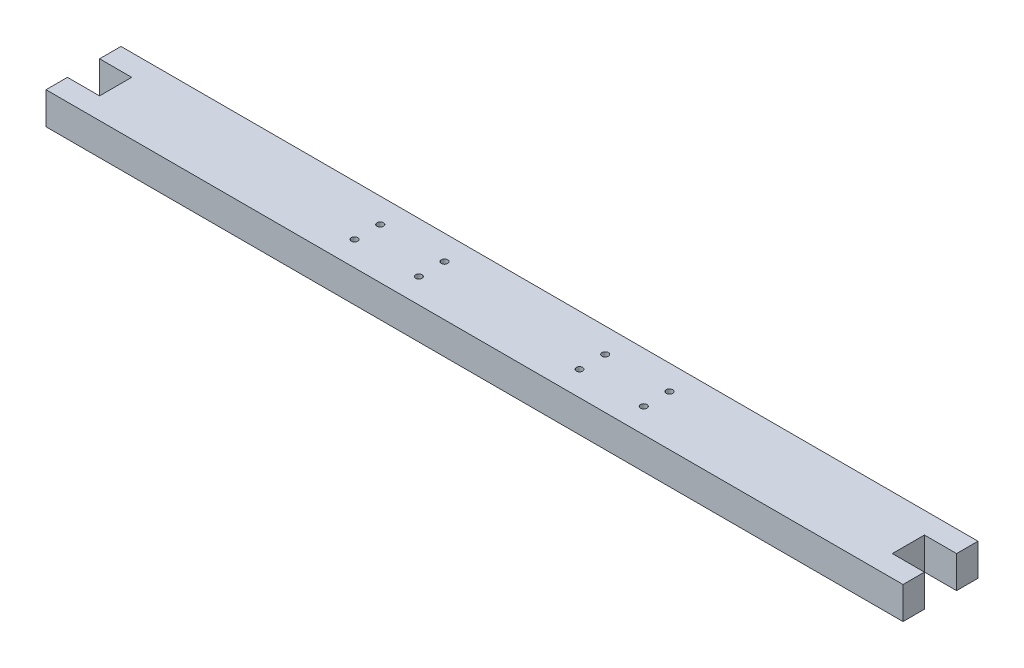
ISO-10303-21;
HEADER;
FILE_DESCRIPTION(('STEP AP214'),'2;1');
FILE_NAME('part.step','',(''),(''),'','','');
FILE_SCHEMA(('AUTOMOTIVE_DESIGN { 1 0 10303 214 1 1 1 1 }'));
ENDSEC;
DATA;
#1=APPLICATION_CONTEXT('core data for automotive mechanical design processes');
#2=APPLICATION_PROTOCOL_DEFINITION('international standard','automotive_design',2000,#1);
#3=PRODUCT_CONTEXT('',#1,'mechanical');
#4=PRODUCT('Part','Part','',(#3));
#5=PRODUCT_RELATED_PRODUCT_CATEGORY('part','',(#4));
#6=PRODUCT_DEFINITION_FORMATION('','',#4);
#7=PRODUCT_DEFINITION_CONTEXT('part definition',#1,'design');
#8=PRODUCT_DEFINITION('design','',#6,#7);
#9=PRODUCT_DEFINITION_SHAPE('','',#8);
#10=(LENGTH_UNIT() NAMED_UNIT(*) SI_UNIT(.MILLI.,.METRE.));
#11=(NAMED_UNIT(*) PLANE_ANGLE_UNIT() SI_UNIT($,.RADIAN.));
#12=(NAMED_UNIT(*) SI_UNIT($,.STERADIAN.) SOLID_ANGLE_UNIT());
#13=UNCERTAINTY_MEASURE_WITH_UNIT(LENGTH_MEASURE(1.E-05),#10,'distance_accuracy_value','');
#14=(GEOMETRIC_REPRESENTATION_CONTEXT(3) GLOBAL_UNCERTAINTY_ASSIGNED_CONTEXT((#13)) GLOBAL_UNIT_ASSIGNED_CONTEXT((#10,
#11,#12)) REPRESENTATION_CONTEXT('',''));
#15=CARTESIAN_POINT('',(0.,0.,0.));
#16=DIRECTION('',(0.,0.,1.));
#17=DIRECTION('',(1.,0.,0.));
#18=AXIS2_PLACEMENT_3D('',#15,#16,#17);
#19=CARTESIAN_POINT('',(0.,15.,-25.));
#20=DIRECTION('',(-1.,0.,0.));
#21=DIRECTION('',(0.,0.,1.));
#22=AXIS2_PLACEMENT_3D('',#19,#20,#21);
#23=PLANE('',#22);
#24=DIRECTION('',(0.,0.,-1.));
#25=VECTOR('',#24,1.);
#26=CARTESIAN_POINT('',(0.,0.,-25.));
#27=LINE('',#26,#25);
#28=CARTESIAN_POINT('',(0.,0.,-25.));
#29=VERTEX_POINT('',#28);
#30=CARTESIAN_POINT('',(0.,0.,-35.));
#31=VERTEX_POINT('',#30);
#32=EDGE_CURVE('E158',#29,#31,#27,.T.);
#33=ORIENTED_EDGE('',*,*,#32,.F.);
#34=DIRECTION('',(0.,-1.,0.));
#35=VECTOR('',#34,1.);
#36=CARTESIAN_POINT('',(0.,15.,-25.));
#37=LINE('',#36,#35);
#38=CARTESIAN_POINT('',(0.,15.,-25.));
#39=VERTEX_POINT('',#38);
#40=EDGE_CURVE('E11',#39,#29,#37,.T.);
#41=ORIENTED_EDGE('',*,*,#40,.F.);
#42=DIRECTION('',(0.,0.,-1.));
#43=VECTOR('',#42,1.);
#44=CARTESIAN_POINT('',(0.,15.,-25.));
#45=LINE('',#44,#43);
#46=CARTESIAN_POINT('',(0.,15.,-35.));
#47=VERTEX_POINT('',#46);
#48=EDGE_CURVE('E187',#39,#47,#45,.T.);
#49=ORIENTED_EDGE('',*,*,#48,.T.);
#50=DIRECTION('',(0.,-1.,0.));
#51=VECTOR('',#50,1.);
#52=CARTESIAN_POINT('',(0.,15.,-35.));
#53=LINE('',#52,#51);
#54=EDGE_CURVE('E39',#47,#31,#53,.T.);
#55=ORIENTED_EDGE('',*,*,#54,.T.);
#56=EDGE_LOOP('',(#33,#41,#49,#55));
#57=FACE_BOUND('',#56,.T.);
#58=ADVANCED_FACE('F36',(#57),#23,.T.);
#59=CARTESIAN_POINT('',(0.,15.,-25.));
#60=DIRECTION('',(0.,0.,-1.));
#61=DIRECTION('',(-1.,0.,0.));
#62=AXIS2_PLACEMENT_3D('',#59,#60,#61);
#63=PLANE('',#62);
#64=DIRECTION('',(1.,0.,0.));
#65=VECTOR('',#64,1.);
#66=CARTESIAN_POINT('',(0.,0.,-25.));
#67=LINE('',#66,#65);
#68=CARTESIAN_POINT('',(15.,0.,-25.));
#69=VERTEX_POINT('',#68);
#70=EDGE_CURVE('E186',#29,#69,#67,.T.);
#71=ORIENTED_EDGE('',*,*,#70,.T.);
#72=DIRECTION('',(0.,-1.,0.));
#73=VECTOR('',#72,1.);
#74=CARTESIAN_POINT('',(15.,15.,-25.));
#75=LINE('',#74,#73);
#76=CARTESIAN_POINT('',(15.,15.,-25.));
#77=VERTEX_POINT('',#76);
#78=EDGE_CURVE('E45',#77,#69,#75,.T.);
#79=ORIENTED_EDGE('',*,*,#78,.F.);
#80=DIRECTION('',(1.,0.,0.));
#81=VECTOR('',#80,1.);
#82=CARTESIAN_POINT('',(0.,15.,-25.));
#83=LINE('',#82,#81);
#84=EDGE_CURVE('E148',#39,#77,#83,.T.);
#85=ORIENTED_EDGE('',*,*,#84,.F.);
#86=ORIENTED_EDGE('',*,*,#40,.T.);
#87=EDGE_LOOP('',(#71,#79,#85,#86));
#88=FACE_BOUND('',#87,.T.);
#89=ADVANCED_FACE('F211',(#88),#63,.F.);
#90=CARTESIAN_POINT('',(15.,15.,-10.));
#91=DIRECTION('',(-1.,0.,0.));
#92=DIRECTION('',(0.,0.,1.));
#93=AXIS2_PLACEMENT_3D('',#90,#91,#92);
#94=PLANE('',#93);
#95=DIRECTION('',(0.,0.,-1.));
#96=VECTOR('',#95,1.);
#97=CARTESIAN_POINT('',(15.,0.,-10.));
#98=LINE('',#97,#96);
#99=CARTESIAN_POINT('',(15.,0.,-10.));
#100=VERTEX_POINT('',#99);
#101=EDGE_CURVE('E134',#100,#69,#98,.T.);
#102=ORIENTED_EDGE('',*,*,#101,.F.);
#103=DIRECTION('',(0.,-1.,0.));
#104=VECTOR('',#103,1.);
#105=CARTESIAN_POINT('',(15.,15.,-10.));
#106=LINE('',#105,#104);
#107=CARTESIAN_POINT('',(15.,15.,-10.));
#108=VERTEX_POINT('',#107);
#109=EDGE_CURVE('E129',#108,#100,#106,.T.);
#110=ORIENTED_EDGE('',*,*,#109,.F.);
#111=DIRECTION('',(0.,0.,-1.));
#112=VECTOR('',#111,1.);
#113=CARTESIAN_POINT('',(15.,15.,-10.));
#114=LINE('',#113,#112);
#115=EDGE_CURVE('E132',#108,#77,#114,.T.);
#116=ORIENTED_EDGE('',*,*,#115,.T.);
#117=ORIENTED_EDGE('',*,*,#78,.T.);
#118=EDGE_LOOP('',(#102,#110,#116,#117));
#119=FACE_BOUND('',#118,.T.);
#120=ADVANCED_FACE('F131',(#119),#94,.T.);
#121=CARTESIAN_POINT('',(0.,15.,-10.));
#122=DIRECTION('',(0.,0.,-1.));
#123=DIRECTION('',(-1.,0.,0.));
#124=AXIS2_PLACEMENT_3D('',#121,#122,#123);
#125=PLANE('',#124);
#126=DIRECTION('',(1.,0.,0.));
#127=VECTOR('',#126,1.);
#128=CARTESIAN_POINT('',(0.,0.,-10.));
#129=LINE('',#128,#127);
#130=CARTESIAN_POINT('',(0.,0.,-10.));
#131=VERTEX_POINT('',#130);
#132=EDGE_CURVE('E183',#131,#100,#129,.T.);
#133=ORIENTED_EDGE('',*,*,#132,.F.);
#134=DIRECTION('',(0.,-1.,0.));
#135=VECTOR('',#134,1.);
#136=CARTESIAN_POINT('',(0.,15.,-10.));
#137=LINE('',#136,#135);
#138=CARTESIAN_POINT('',(0.,15.,-10.));
#139=VERTEX_POINT('',#138);
#140=EDGE_CURVE('E139',#139,#131,#137,.T.);
#141=ORIENTED_EDGE('',*,*,#140,.F.);
#142=DIRECTION('',(1.,0.,0.));
#143=VECTOR('',#142,1.);
#144=CARTESIAN_POINT('',(0.,15.,-10.));
#145=LINE('',#144,#143);
#146=EDGE_CURVE('E146',#139,#108,#145,.T.);
#147=ORIENTED_EDGE('',*,*,#146,.T.);
#148=ORIENTED_EDGE('',*,*,#109,.T.);
#149=EDGE_LOOP('',(#133,#141,#147,#148));
#150=FACE_BOUND('',#149,.T.);
#151=ADVANCED_FACE('F150',(#150),#125,.T.);
#152=CARTESIAN_POINT('',(0.,15.,0.));
#153=DIRECTION('',(-1.,0.,0.));
#154=DIRECTION('',(0.,0.,1.));
#155=AXIS2_PLACEMENT_3D('',#152,#153,#154);
#156=PLANE('',#155);
#157=DIRECTION('',(0.,0.,-1.));
#158=VECTOR('',#157,1.);
#159=CARTESIAN_POINT('',(0.,0.,0.));
#160=LINE('',#159,#158);
#161=CARTESIAN_POINT('',(0.,0.,0.));
#162=VERTEX_POINT('',#161);
#163=EDGE_CURVE('E180',#162,#131,#160,.T.);
#164=ORIENTED_EDGE('',*,*,#163,.F.);
#165=DIRECTION('',(0.,-1.,0.));
#166=VECTOR('',#165,1.);
#167=CARTESIAN_POINT('',(0.,15.,0.));
#168=LINE('',#167,#166);
#169=CARTESIAN_POINT('',(0.,15.,0.));
#170=VERTEX_POINT('',#169);
#171=EDGE_CURVE('E191',#170,#162,#168,.T.);
#172=ORIENTED_EDGE('',*,*,#171,.F.);
#173=DIRECTION('',(0.,0.,-1.));
#174=VECTOR('',#173,1.);
#175=CARTESIAN_POINT('',(0.,15.,0.));
#176=LINE('',#175,#174);
#177=EDGE_CURVE('E151',#170,#139,#176,.T.);
#178=ORIENTED_EDGE('',*,*,#177,.T.);
#179=ORIENTED_EDGE('',*,*,#140,.T.);
#180=EDGE_LOOP('',(#164,#172,#178,#179));
#181=FACE_BOUND('',#180,.T.);
#182=ADVANCED_FACE('F258',(#181),#156,.T.);
#183=CARTESIAN_POINT('',(0.,15.,0.));
#184=DIRECTION('',(0.,0.,-1.));
#185=DIRECTION('',(-1.,0.,0.));
#186=AXIS2_PLACEMENT_3D('',#183,#184,#185);
#187=PLANE('',#186);
#188=DIRECTION('',(1.,0.,0.));
#189=VECTOR('',#188,1.);
#190=CARTESIAN_POINT('',(0.,0.,0.));
#191=LINE('',#190,#189);
#192=CARTESIAN_POINT('',(400.,0.,1.01307850997046E-13));
#193=VERTEX_POINT('',#192);
#194=EDGE_CURVE('E178',#162,#193,#191,.T.);
#195=ORIENTED_EDGE('',*,*,#194,.T.);
#196=DIRECTION('',(0.,-1.,0.));
#197=VECTOR('',#196,1.);
#198=CARTESIAN_POINT('',(400.,15.,1.01307850997046E-13));
#199=LINE('',#198,#197);
#200=CARTESIAN_POINT('',(400.,15.,1.01307850997046E-13));
#201=VERTEX_POINT('',#200);
#202=EDGE_CURVE('E193',#201,#193,#199,.T.);
#203=ORIENTED_EDGE('',*,*,#202,.F.);
#204=DIRECTION('',(1.,0.,0.));
#205=VECTOR('',#204,1.);
#206=CARTESIAN_POINT('',(0.,15.,0.));
#207=LINE('',#206,#205);
#208=EDGE_CURVE('E153',#170,#201,#207,.T.);
#209=ORIENTED_EDGE('',*,*,#208,.F.);
#210=ORIENTED_EDGE('',*,*,#171,.T.);
#211=EDGE_LOOP('',(#195,#203,#209,#210));
#212=FACE_BOUND('',#211,.T.);
#213=ADVANCED_FACE('F234',(#212),#187,.F.);
#214=CARTESIAN_POINT('',(400.,15.,1.01307850997046E-13));
#215=DIRECTION('',(-1.,0.,0.));
#216=DIRECTION('',(0.,0.,1.));
#217=AXIS2_PLACEMENT_3D('',#214,#215,#216);
#218=PLANE('',#217);
#219=DIRECTION('',(0.,0.,-1.));
#220=VECTOR('',#219,1.);
#221=CARTESIAN_POINT('',(400.,0.,1.01307850997046E-13));
#222=LINE('',#221,#220);
#223=CARTESIAN_POINT('',(400.,0.,-9.9999999999999));
#224=VERTEX_POINT('',#223);
#225=EDGE_CURVE('E176',#193,#224,#222,.T.);
#226=ORIENTED_EDGE('',*,*,#225,.T.);
#227=DIRECTION('',(0.,-1.,0.));
#228=VECTOR('',#227,1.);
#229=CARTESIAN_POINT('',(400.,15.,-9.9999999999999));
#230=LINE('',#229,#228);
#231=CARTESIAN_POINT('',(400.,15.,-9.9999999999999));
#232=VERTEX_POINT('',#231);
#233=EDGE_CURVE('E196',#232,#224,#230,.T.);
#234=ORIENTED_EDGE('',*,*,#233,.F.);
#235=DIRECTION('',(0.,0.,-1.));
#236=VECTOR('',#235,1.);
#237=CARTESIAN_POINT('',(400.,15.,1.01307850997046E-13));
#238=LINE('',#237,#236);
#239=EDGE_CURVE('E228',#201,#232,#238,.T.);
#240=ORIENTED_EDGE('',*,*,#239,.F.);
#241=ORIENTED_EDGE('',*,*,#202,.T.);
#242=EDGE_LOOP('',(#226,#234,#240,#241));
#243=FACE_BOUND('',#242,.T.);
#244=ADVANCED_FACE('F238',(#243),#218,.F.);
#245=CARTESIAN_POINT('',(400.,15.,-9.9999999999999));
#246=DIRECTION('',(0.,0.,1.));
#247=DIRECTION('',(1.,0.,0.));
#248=AXIS2_PLACEMENT_3D('',#245,#246,#247);
#249=PLANE('',#248);
#250=DIRECTION('',(-1.,0.,0.));
#251=VECTOR('',#250,1.);
#252=CARTESIAN_POINT('',(400.,0.,-9.9999999999999));
#253=LINE('',#252,#251);
#254=CARTESIAN_POINT('',(385.,0.,-9.9999999999999));
#255=VERTEX_POINT('',#254);
#256=EDGE_CURVE('E174',#224,#255,#253,.T.);
#257=ORIENTED_EDGE('',*,*,#256,.T.);
#258=DIRECTION('',(0.,-1.,0.));
#259=VECTOR('',#258,1.);
#260=CARTESIAN_POINT('',(385.,15.,-9.9999999999999));
#261=LINE('',#260,#259);
#262=CARTESIAN_POINT('',(385.,15.,-9.9999999999999));
#263=VERTEX_POINT('',#262);
#264=EDGE_CURVE('E199',#263,#255,#261,.T.);
#265=ORIENTED_EDGE('',*,*,#264,.F.);
#266=DIRECTION('',(-1.,0.,0.));
#267=VECTOR('',#266,1.);
#268=CARTESIAN_POINT('',(400.,15.,-9.9999999999999));
#269=LINE('',#268,#267);
#270=EDGE_CURVE('E226',#232,#263,#269,.T.);
#271=ORIENTED_EDGE('',*,*,#270,.F.);
#272=ORIENTED_EDGE('',*,*,#233,.T.);
#273=EDGE_LOOP('',(#257,#265,#271,#272));
#274=FACE_BOUND('',#273,.T.);
#275=ADVANCED_FACE('F243',(#274),#249,.F.);
#276=CARTESIAN_POINT('',(385.,15.,-9.9999999999999));
#277=DIRECTION('',(-1.,0.,0.));
#278=DIRECTION('',(0.,0.,1.));
#279=AXIS2_PLACEMENT_3D('',#276,#277,#278);
#280=PLANE('',#279);
#281=DIRECTION('',(0.,0.,-1.));
#282=VECTOR('',#281,1.);
#283=CARTESIAN_POINT('',(385.,0.,-9.9999999999999));
#284=LINE('',#283,#282);
#285=CARTESIAN_POINT('',(385.,0.,-24.9999999999999));
#286=VERTEX_POINT('',#285);
#287=EDGE_CURVE('E171',#255,#286,#284,.T.);
#288=ORIENTED_EDGE('',*,*,#287,.T.);
#289=DIRECTION('',(0.,-1.,0.));
#290=VECTOR('',#289,1.);
#291=CARTESIAN_POINT('',(385.,15.,-24.9999999999999));
#292=LINE('',#291,#290);
#293=CARTESIAN_POINT('',(385.,15.,-24.9999999999999));
#294=VERTEX_POINT('',#293);
#295=EDGE_CURVE('E202',#294,#286,#292,.T.);
#296=ORIENTED_EDGE('',*,*,#295,.F.);
#297=DIRECTION('',(0.,0.,-1.));
#298=VECTOR('',#297,1.);
#299=CARTESIAN_POINT('',(385.,15.,-9.9999999999999));
#300=LINE('',#299,#298);
#301=EDGE_CURVE('E224',#263,#294,#300,.T.);
#302=ORIENTED_EDGE('',*,*,#301,.F.);
#303=ORIENTED_EDGE('',*,*,#264,.T.);
#304=EDGE_LOOP('',(#288,#296,#302,#303));
#305=FACE_BOUND('',#304,.T.);
#306=ADVANCED_FACE('F248',(#305),#280,.F.);
#307=CARTESIAN_POINT('',(400.,15.,-24.9999999999999));
#308=DIRECTION('',(0.,0.,1.));
#309=DIRECTION('',(1.,0.,0.));
#310=AXIS2_PLACEMENT_3D('',#307,#308,#309);
#311=PLANE('',#310);
#312=DIRECTION('',(-1.,0.,0.));
#313=VECTOR('',#312,1.);
#314=CARTESIAN_POINT('',(400.,0.,-24.9999999999999));
#315=LINE('',#314,#313);
#316=CARTESIAN_POINT('',(400.,0.,-24.9999999999999));
#317=VERTEX_POINT('',#316);
#318=EDGE_CURVE('E168',#317,#286,#315,.T.);
#319=ORIENTED_EDGE('',*,*,#318,.F.);
#320=DIRECTION('',(0.,-1.,0.));
#321=VECTOR('',#320,1.);
#322=CARTESIAN_POINT('',(400.,15.,-24.9999999999999));
#323=LINE('',#322,#321);
#324=CARTESIAN_POINT('',(400.,15.,-24.9999999999999));
#325=VERTEX_POINT('',#324);
#326=EDGE_CURVE('E204',#325,#317,#323,.T.);
#327=ORIENTED_EDGE('',*,*,#326,.F.);
#328=DIRECTION('',(-1.,0.,0.));
#329=VECTOR('',#328,1.);
#330=CARTESIAN_POINT('',(400.,15.,-24.9999999999999));
#331=LINE('',#330,#329);
#332=EDGE_CURVE('E221',#325,#294,#331,.T.);
#333=ORIENTED_EDGE('',*,*,#332,.T.);
#334=ORIENTED_EDGE('',*,*,#295,.T.);
#335=EDGE_LOOP('',(#319,#327,#333,#334));
#336=FACE_BOUND('',#335,.T.);
#337=ADVANCED_FACE('F252',(#336),#311,.T.);
#338=CARTESIAN_POINT('',(400.,15.,-24.9999999999999));
#339=DIRECTION('',(-1.,0.,0.));
#340=DIRECTION('',(0.,0.,1.));
#341=AXIS2_PLACEMENT_3D('',#338,#339,#340);
#342=PLANE('',#341);
#343=DIRECTION('',(0.,0.,-1.));
#344=VECTOR('',#343,1.);
#345=CARTESIAN_POINT('',(400.,0.,-24.9999999999999));
#346=LINE('',#345,#344);
#347=CARTESIAN_POINT('',(400.,0.,-34.9999999999999));
#348=VERTEX_POINT('',#347);
#349=EDGE_CURVE('E165',#317,#348,#346,.T.);
#350=ORIENTED_EDGE('',*,*,#349,.T.);
#351=DIRECTION('',(0.,-1.,0.));
#352=VECTOR('',#351,1.);
#353=CARTESIAN_POINT('',(400.,15.,-34.9999999999999));
#354=LINE('',#353,#352);
#355=CARTESIAN_POINT('',(400.,15.,-34.9999999999999));
#356=VERTEX_POINT('',#355);
#357=EDGE_CURVE('E205',#356,#348,#354,.T.);
#358=ORIENTED_EDGE('',*,*,#357,.F.);
#359=DIRECTION('',(0.,0.,-1.));
#360=VECTOR('',#359,1.);
#361=CARTESIAN_POINT('',(400.,15.,-24.9999999999999));
#362=LINE('',#361,#360);
#363=EDGE_CURVE('E214',#325,#356,#362,.T.);
#364=ORIENTED_EDGE('',*,*,#363,.F.);
#365=ORIENTED_EDGE('',*,*,#326,.T.);
#366=EDGE_LOOP('',(#350,#358,#364,#365));
#367=FACE_BOUND('',#366,.T.);
#368=ADVANCED_FACE('F255',(#367),#342,.F.);
#369=CARTESIAN_POINT('',(0.,15.,-35.));
#370=DIRECTION('',(0.,0.,-1.));
#371=DIRECTION('',(-1.,0.,0.));
#372=AXIS2_PLACEMENT_3D('',#369,#370,#371);
#373=PLANE('',#372);
#374=DIRECTION('',(1.,0.,0.));
#375=VECTOR('',#374,1.);
#376=CARTESIAN_POINT('',(0.,0.,-35.));
#377=LINE('',#376,#375);
#378=EDGE_CURVE('E161',#31,#348,#377,.T.);
#379=ORIENTED_EDGE('',*,*,#378,.F.);
#380=ORIENTED_EDGE('',*,*,#54,.F.);
#381=DIRECTION('',(1.,0.,0.));
#382=VECTOR('',#381,1.);
#383=CARTESIAN_POINT('',(0.,15.,-35.));
#384=LINE('',#383,#382);
#385=EDGE_CURVE('E212',#47,#356,#384,.T.);
#386=ORIENTED_EDGE('',*,*,#385,.T.);
#387=ORIENTED_EDGE('',*,*,#357,.T.);
#388=EDGE_LOOP('',(#379,#380,#386,#387));
#389=FACE_BOUND('',#388,.T.);
#390=ADVANCED_FACE('F207',(#389),#373,.T.);
#391=CARTESIAN_POINT('',(0.,15.,0.));
#392=DIRECTION('',(0.,-1.,0.));
#393=DIRECTION('',(0.,0.,-1.));
#394=AXIS2_PLACEMENT_3D('',#391,#392,#393);
#395=PLANE('',#394);
#396=CARTESIAN_POINT('',(162.5,15.,-11.5));
#397=DIRECTION('',(0.,1.,0.));
#398=DIRECTION('',(0.,0.,1.));
#399=AXIS2_PLACEMENT_3D('',#396,#397,#398);
#400=CIRCLE('',#399,1.5);
#401=CARTESIAN_POINT('',(162.5,15.,-10.));
#402=VERTEX_POINT('',#401);
#403=EDGE_CURVE('E326',#402,#402,#400,.T.);
#404=ORIENTED_EDGE('',*,*,#403,.F.);
#405=EDGE_LOOP('',(#404));
#406=FACE_BOUND('',#405,.T.);
#407=CARTESIAN_POINT('',(237.5,15.,-23.5));
#408=DIRECTION('',(0.,1.,0.));
#409=DIRECTION('',(0.,0.,1.));
#410=AXIS2_PLACEMENT_3D('',#407,#408,#409);
#411=CIRCLE('',#410,1.49999999999997);
#412=CARTESIAN_POINT('',(237.5,15.,-22.0000000000001));
#413=VERTEX_POINT('',#412);
#414=EDGE_CURVE('E344',#413,#413,#411,.T.);
#415=ORIENTED_EDGE('',*,*,#414,.F.);
#416=EDGE_LOOP('',(#415));
#417=FACE_BOUND('',#416,.T.);
#418=CARTESIAN_POINT('',(237.5,15.,-11.5));
#419=DIRECTION('',(0.,1.,0.));
#420=DIRECTION('',(0.,0.,1.));
#421=AXIS2_PLACEMENT_3D('',#418,#419,#420);
#422=CIRCLE('',#421,1.50000000000003);
#423=CARTESIAN_POINT('',(237.5,15.,-9.99999999999999));
#424=VERTEX_POINT('',#423);
#425=EDGE_CURVE('E343',#424,#424,#422,.T.);
#426=ORIENTED_EDGE('',*,*,#425,.F.);
#427=EDGE_LOOP('',(#426));
#428=FACE_BOUND('',#427,.T.);
#429=CARTESIAN_POINT('',(267.5,15.,-23.5));
#430=DIRECTION('',(0.,1.,0.));
#431=DIRECTION('',(0.,0.,1.));
#432=AXIS2_PLACEMENT_3D('',#429,#430,#431);
#433=CIRCLE('',#432,1.50000000000002);
#434=CARTESIAN_POINT('',(267.5,15.,-22.));
#435=VERTEX_POINT('',#434);
#436=EDGE_CURVE('E355',#435,#435,#433,.T.);
#437=ORIENTED_EDGE('',*,*,#436,.F.);
#438=EDGE_LOOP('',(#437));
#439=FACE_BOUND('',#438,.T.);
#440=CARTESIAN_POINT('',(132.5,15.,-11.5));
#441=DIRECTION('',(0.,1.,0.));
#442=DIRECTION('',(0.,0.,1.));
#443=AXIS2_PLACEMENT_3D('',#440,#441,#442);
#444=CIRCLE('',#443,1.5);
#445=CARTESIAN_POINT('',(132.5,15.,-10.));
#446=VERTEX_POINT('',#445);
#447=EDGE_CURVE('E322',#446,#446,#444,.T.);
#448=ORIENTED_EDGE('',*,*,#447,.F.);
#449=EDGE_LOOP('',(#448));
#450=FACE_BOUND('',#449,.T.);
#451=CARTESIAN_POINT('',(132.5,15.,-23.5));
#452=DIRECTION('',(0.,1.,0.));
#453=DIRECTION('',(0.,0.,1.));
#454=AXIS2_PLACEMENT_3D('',#451,#452,#453);
#455=CIRCLE('',#454,1.5);
#456=CARTESIAN_POINT('',(132.5,15.,-22.));
#457=VERTEX_POINT('',#456);
#458=EDGE_CURVE('E329',#457,#457,#455,.T.);
#459=ORIENTED_EDGE('',*,*,#458,.F.);
#460=EDGE_LOOP('',(#459));
#461=FACE_BOUND('',#460,.T.);
#462=CARTESIAN_POINT('',(162.5,15.,-23.5));
#463=DIRECTION('',(0.,1.,0.));
#464=DIRECTION('',(0.,0.,1.));
#465=AXIS2_PLACEMENT_3D('',#462,#463,#464);
#466=CIRCLE('',#465,1.5);
#467=CARTESIAN_POINT('',(162.5,15.,-22.));
#468=VERTEX_POINT('',#467);
#469=EDGE_CURVE('E337',#468,#468,#466,.T.);
#470=ORIENTED_EDGE('',*,*,#469,.F.);
#471=EDGE_LOOP('',(#470));
#472=FACE_BOUND('',#471,.T.);
#473=CARTESIAN_POINT('',(267.5,15.,-11.5));
#474=DIRECTION('',(0.,1.,0.));
#475=DIRECTION('',(0.,0.,1.));
#476=AXIS2_PLACEMENT_3D('',#473,#474,#475);
#477=CIRCLE('',#476,1.49999999999997);
#478=CARTESIAN_POINT('',(267.5,15.,-10.0000000000001));
#479=VERTEX_POINT('',#478);
#480=EDGE_CURVE('E217',#479,#479,#477,.T.);
#481=ORIENTED_EDGE('',*,*,#480,.F.);
#482=EDGE_LOOP('',(#481));
#483=FACE_BOUND('',#482,.T.);
#484=ORIENTED_EDGE('',*,*,#48,.F.);
#485=ORIENTED_EDGE('',*,*,#84,.T.);
#486=ORIENTED_EDGE('',*,*,#115,.F.);
#487=ORIENTED_EDGE('',*,*,#146,.F.);
#488=ORIENTED_EDGE('',*,*,#177,.F.);
#489=ORIENTED_EDGE('',*,*,#208,.T.);
#490=ORIENTED_EDGE('',*,*,#239,.T.);
#491=ORIENTED_EDGE('',*,*,#270,.T.);
#492=ORIENTED_EDGE('',*,*,#301,.T.);
#493=ORIENTED_EDGE('',*,*,#332,.F.);
#494=ORIENTED_EDGE('',*,*,#363,.T.);
#495=ORIENTED_EDGE('',*,*,#385,.F.);
#496=EDGE_LOOP('',(#484,#485,#486,#487,#488,#489,#490,#491,#492,#493,#494,#495));
#497=FACE_BOUND('',#496,.T.);
#498=ADVANCED_FACE('F144',(#406,#417,#428,#439,#450,#461,#472,#483,#497),#395,.F.);
#499=CARTESIAN_POINT('',(0.,0.,0.));
#500=DIRECTION('',(0.,-1.,0.));
#501=DIRECTION('',(0.,0.,-1.));
#502=AXIS2_PLACEMENT_3D('',#499,#500,#501);
#503=PLANE('',#502);
#504=CARTESIAN_POINT('',(162.5,0.,-11.5));
#505=DIRECTION('',(0.,1.,0.));
#506=DIRECTION('',(0.,0.,1.));
#507=AXIS2_PLACEMENT_3D('',#504,#505,#506);
#508=CIRCLE('',#507,1.5);
#509=CARTESIAN_POINT('',(162.5,0.,-10.));
#510=VERTEX_POINT('',#509);
#511=EDGE_CURVE('E347',#510,#510,#508,.T.);
#512=ORIENTED_EDGE('',*,*,#511,.T.);
#513=EDGE_LOOP('',(#512));
#514=FACE_BOUND('',#513,.T.);
#515=CARTESIAN_POINT('',(237.5,0.,-23.5));
#516=DIRECTION('',(0.,1.,0.));
#517=DIRECTION('',(0.,0.,1.));
#518=AXIS2_PLACEMENT_3D('',#515,#516,#517);
#519=CIRCLE('',#518,1.49999999999997);
#520=CARTESIAN_POINT('',(237.5,0.,-22.0000000000001));
#521=VERTEX_POINT('',#520);
#522=EDGE_CURVE('E340',#521,#521,#519,.T.);
#523=ORIENTED_EDGE('',*,*,#522,.T.);
#524=EDGE_LOOP('',(#523));
#525=FACE_BOUND('',#524,.T.);
#526=CARTESIAN_POINT('',(237.5,0.,-11.5));
#527=DIRECTION('',(0.,1.,0.));
#528=DIRECTION('',(0.,0.,1.));
#529=AXIS2_PLACEMENT_3D('',#526,#527,#528);
#530=CIRCLE('',#529,1.50000000000003);
#531=CARTESIAN_POINT('',(237.5,0.,-9.99999999999999));
#532=VERTEX_POINT('',#531);
#533=EDGE_CURVE('E358',#532,#532,#530,.T.);
#534=ORIENTED_EDGE('',*,*,#533,.T.);
#535=EDGE_LOOP('',(#534));
#536=FACE_BOUND('',#535,.T.);
#537=CARTESIAN_POINT('',(267.5,0.,-23.5));
#538=DIRECTION('',(0.,1.,0.));
#539=DIRECTION('',(0.,0.,1.));
#540=AXIS2_PLACEMENT_3D('',#537,#538,#539);
#541=CIRCLE('',#540,1.50000000000002);
#542=CARTESIAN_POINT('',(267.5,0.,-22.));
#543=VERTEX_POINT('',#542);
#544=EDGE_CURVE('E352',#543,#543,#541,.T.);
#545=ORIENTED_EDGE('',*,*,#544,.T.);
#546=EDGE_LOOP('',(#545));
#547=FACE_BOUND('',#546,.T.);
#548=CARTESIAN_POINT('',(132.5,0.,-11.5));
#549=DIRECTION('',(0.,1.,0.));
#550=DIRECTION('',(0.,0.,1.));
#551=AXIS2_PLACEMENT_3D('',#548,#549,#550);
#552=CIRCLE('',#551,1.5);
#553=CARTESIAN_POINT('',(132.5,0.,-10.));
#554=VERTEX_POINT('',#553);
#555=EDGE_CURVE('E319',#554,#554,#552,.T.);
#556=ORIENTED_EDGE('',*,*,#555,.T.);
#557=EDGE_LOOP('',(#556));
#558=FACE_BOUND('',#557,.T.);
#559=CARTESIAN_POINT('',(132.5,0.,-23.5));
#560=DIRECTION('',(0.,1.,0.));
#561=DIRECTION('',(0.,0.,1.));
#562=AXIS2_PLACEMENT_3D('',#559,#560,#561);
#563=CIRCLE('',#562,1.5);
#564=CARTESIAN_POINT('',(132.5,0.,-22.));
#565=VERTEX_POINT('',#564);
#566=EDGE_CURVE('E324',#565,#565,#563,.T.);
#567=ORIENTED_EDGE('',*,*,#566,.T.);
#568=EDGE_LOOP('',(#567));
#569=FACE_BOUND('',#568,.T.);
#570=CARTESIAN_POINT('',(162.5,0.,-23.5));
#571=DIRECTION('',(0.,1.,0.));
#572=DIRECTION('',(0.,0.,1.));
#573=AXIS2_PLACEMENT_3D('',#570,#571,#572);
#574=CIRCLE('',#573,1.5);
#575=CARTESIAN_POINT('',(162.5,0.,-22.));
#576=VERTEX_POINT('',#575);
#577=EDGE_CURVE('E334',#576,#576,#574,.T.);
#578=ORIENTED_EDGE('',*,*,#577,.T.);
#579=EDGE_LOOP('',(#578));
#580=FACE_BOUND('',#579,.T.);
#581=CARTESIAN_POINT('',(267.5,0.,-11.5));
#582=DIRECTION('',(0.,1.,0.));
#583=DIRECTION('',(0.,0.,1.));
#584=AXIS2_PLACEMENT_3D('',#581,#582,#583);
#585=CIRCLE('',#584,1.49999999999997);
#586=CARTESIAN_POINT('',(267.5,0.,-10.0000000000001));
#587=VERTEX_POINT('',#586);
#588=EDGE_CURVE('E162',#587,#587,#585,.T.);
#589=ORIENTED_EDGE('',*,*,#588,.T.);
#590=EDGE_LOOP('',(#589));
#591=FACE_BOUND('',#590,.T.);
#592=ORIENTED_EDGE('',*,*,#32,.T.);
#593=ORIENTED_EDGE('',*,*,#378,.T.);
#594=ORIENTED_EDGE('',*,*,#349,.F.);
#595=ORIENTED_EDGE('',*,*,#318,.T.);
#596=ORIENTED_EDGE('',*,*,#287,.F.);
#597=ORIENTED_EDGE('',*,*,#256,.F.);
#598=ORIENTED_EDGE('',*,*,#225,.F.);
#599=ORIENTED_EDGE('',*,*,#194,.F.);
#600=ORIENTED_EDGE('',*,*,#163,.T.);
#601=ORIENTED_EDGE('',*,*,#132,.T.);
#602=ORIENTED_EDGE('',*,*,#101,.T.);
#603=ORIENTED_EDGE('',*,*,#70,.F.);
#604=EDGE_LOOP('',(#592,#593,#594,#595,#596,#597,#598,#599,#600,#601,#602,#603));
#605=FACE_BOUND('',#604,.T.);
#606=ADVANCED_FACE('F210',(#514,#525,#536,#547,#558,#569,#580,#591,#605),#503,.T.);
#607=CARTESIAN_POINT('',(267.5,0.,-11.5));
#608=DIRECTION('',(0.,1.,0.));
#609=DIRECTION('',(0.,0.,1.));
#610=AXIS2_PLACEMENT_3D('',#607,#608,#609);
#611=CYLINDRICAL_SURFACE('',#610,1.49999999999997);
#612=ORIENTED_EDGE('',*,*,#588,.F.);
#613=EDGE_LOOP('',(#612));
#614=FACE_BOUND('',#613,.T.);
#615=ORIENTED_EDGE('',*,*,#480,.T.);
#616=EDGE_LOOP('',(#615));
#617=FACE_BOUND('',#616,.T.);
#618=ADVANCED_FACE('F279',(#614,#617),#611,.F.);
#619=CARTESIAN_POINT('',(162.5,0.,-23.5));
#620=DIRECTION('',(0.,1.,0.));
#621=DIRECTION('',(0.,0.,1.));
#622=AXIS2_PLACEMENT_3D('',#619,#620,#621);
#623=CYLINDRICAL_SURFACE('',#622,1.5);
#624=ORIENTED_EDGE('',*,*,#577,.F.);
#625=EDGE_LOOP('',(#624));
#626=FACE_BOUND('',#625,.T.);
#627=ORIENTED_EDGE('',*,*,#469,.T.);
#628=EDGE_LOOP('',(#627));
#629=FACE_BOUND('',#628,.T.);
#630=ADVANCED_FACE('F286',(#626,#629),#623,.F.);
#631=CARTESIAN_POINT('',(132.5,0.,-23.5));
#632=DIRECTION('',(0.,1.,0.));
#633=DIRECTION('',(0.,0.,1.));
#634=AXIS2_PLACEMENT_3D('',#631,#632,#633);
#635=CYLINDRICAL_SURFACE('',#634,1.5);
#636=ORIENTED_EDGE('',*,*,#566,.F.);
#637=EDGE_LOOP('',(#636));
#638=FACE_BOUND('',#637,.T.);
#639=ORIENTED_EDGE('',*,*,#458,.T.);
#640=EDGE_LOOP('',(#639));
#641=FACE_BOUND('',#640,.T.);
#642=ADVANCED_FACE('F307',(#638,#641),#635,.F.);
#643=CARTESIAN_POINT('',(132.5,0.,-11.5));
#644=DIRECTION('',(0.,1.,0.));
#645=DIRECTION('',(0.,0.,1.));
#646=AXIS2_PLACEMENT_3D('',#643,#644,#645);
#647=CYLINDRICAL_SURFACE('',#646,1.5);
#648=ORIENTED_EDGE('',*,*,#555,.F.);
#649=EDGE_LOOP('',(#648));
#650=FACE_BOUND('',#649,.T.);
#651=ORIENTED_EDGE('',*,*,#447,.T.);
#652=EDGE_LOOP('',(#651));
#653=FACE_BOUND('',#652,.T.);
#654=ADVANCED_FACE('F296',(#650,#653),#647,.F.);
#655=CARTESIAN_POINT('',(267.5,0.,-23.5));
#656=DIRECTION('',(0.,1.,0.));
#657=DIRECTION('',(0.,0.,1.));
#658=AXIS2_PLACEMENT_3D('',#655,#656,#657);
#659=CYLINDRICAL_SURFACE('',#658,1.50000000000002);
#660=ORIENTED_EDGE('',*,*,#544,.F.);
#661=EDGE_LOOP('',(#660));
#662=FACE_BOUND('',#661,.T.);
#663=ORIENTED_EDGE('',*,*,#436,.T.);
#664=EDGE_LOOP('',(#663));
#665=FACE_BOUND('',#664,.T.);
#666=ADVANCED_FACE('F292',(#662,#665),#659,.F.);
#667=CARTESIAN_POINT('',(237.5,0.,-11.5));
#668=DIRECTION('',(0.,1.,0.));
#669=DIRECTION('',(0.,0.,1.));
#670=AXIS2_PLACEMENT_3D('',#667,#668,#669);
#671=CYLINDRICAL_SURFACE('',#670,1.50000000000003);
#672=ORIENTED_EDGE('',*,*,#533,.F.);
#673=EDGE_LOOP('',(#672));
#674=FACE_BOUND('',#673,.T.);
#675=ORIENTED_EDGE('',*,*,#425,.T.);
#676=EDGE_LOOP('',(#675));
#677=FACE_BOUND('',#676,.T.);
#678=ADVANCED_FACE('F288',(#674,#677),#671,.F.);
#679=CARTESIAN_POINT('',(237.5,0.,-23.5));
#680=DIRECTION('',(0.,1.,0.));
#681=DIRECTION('',(0.,0.,1.));
#682=AXIS2_PLACEMENT_3D('',#679,#680,#681);
#683=CYLINDRICAL_SURFACE('',#682,1.49999999999997);
#684=ORIENTED_EDGE('',*,*,#522,.F.);
#685=EDGE_LOOP('',(#684));
#686=FACE_BOUND('',#685,.T.);
#687=ORIENTED_EDGE('',*,*,#414,.T.);
#688=EDGE_LOOP('',(#687));
#689=FACE_BOUND('',#688,.T.);
#690=ADVANCED_FACE('F291',(#686,#689),#683,.F.);
#691=CARTESIAN_POINT('',(162.5,0.,-11.5));
#692=DIRECTION('',(0.,1.,0.));
#693=DIRECTION('',(0.,0.,1.));
#694=AXIS2_PLACEMENT_3D('',#691,#692,#693);
#695=CYLINDRICAL_SURFACE('',#694,1.5);
#696=ORIENTED_EDGE('',*,*,#511,.F.);
#697=EDGE_LOOP('',(#696));
#698=FACE_BOUND('',#697,.T.);
#699=ORIENTED_EDGE('',*,*,#403,.T.);
#700=EDGE_LOOP('',(#699));
#701=FACE_BOUND('',#700,.T.);
#702=ADVANCED_FACE('F298',(#698,#701),#695,.F.);
#703=CLOSED_SHELL('',(#58,#89,#120,#151,#182,#213,#244,#275,#306,#337,#368,#390,#498,#606,#618,
#630,#642,#654,#666,#678,#690,#702));
#704=MANIFOLD_SOLID_BREP('B2',#703);
#705=ADVANCED_BREP_SHAPE_REPRESENTATION('',(#18,#704),#14);
#706=SHAPE_DEFINITION_REPRESENTATION(#9,#705);
ENDSEC;
END-ISO-10303-21;
